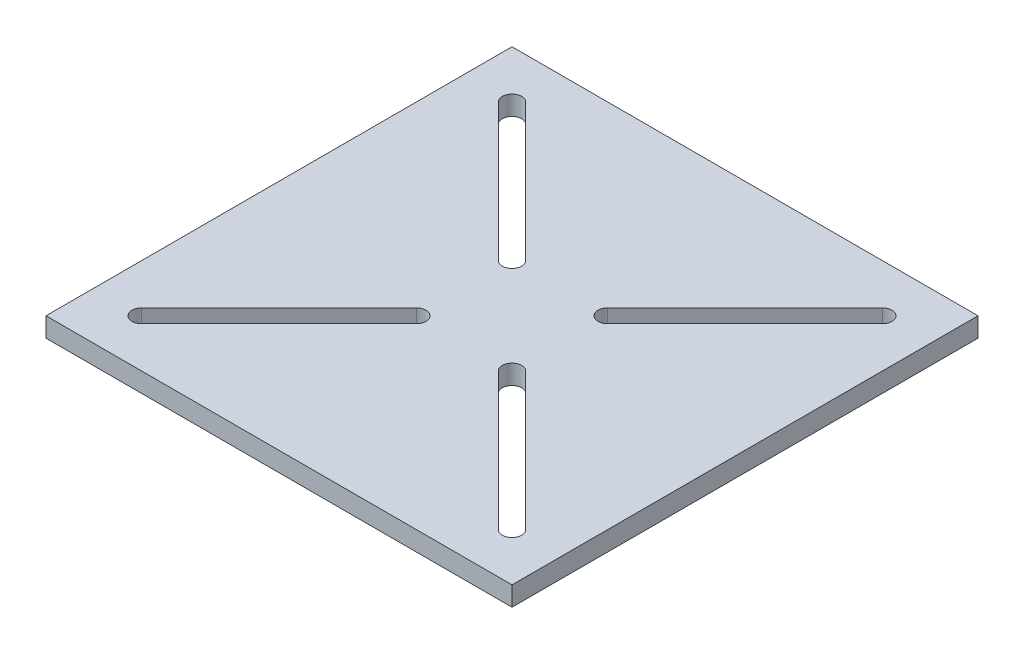
ISO-10303-21;
HEADER;
FILE_DESCRIPTION(('STEP AP214'),'2;1');
FILE_NAME('part.step','',(''),(''),'','','');
FILE_SCHEMA(('AUTOMOTIVE_DESIGN { 1 0 10303 214 1 1 1 1 }'));
ENDSEC;
DATA;
#1=APPLICATION_CONTEXT('core data for automotive mechanical design processes');
#2=APPLICATION_PROTOCOL_DEFINITION('international standard','automotive_design',2000,#1);
#3=PRODUCT_CONTEXT('',#1,'mechanical');
#4=PRODUCT('Part','Part','',(#3));
#5=PRODUCT_RELATED_PRODUCT_CATEGORY('part','',(#4));
#6=PRODUCT_DEFINITION_FORMATION('','',#4);
#7=PRODUCT_DEFINITION_CONTEXT('part definition',#1,'design');
#8=PRODUCT_DEFINITION('design','',#6,#7);
#9=PRODUCT_DEFINITION_SHAPE('','',#8);
#10=(LENGTH_UNIT() NAMED_UNIT(*) SI_UNIT(.MILLI.,.METRE.));
#11=(NAMED_UNIT(*) PLANE_ANGLE_UNIT() SI_UNIT($,.RADIAN.));
#12=(NAMED_UNIT(*) SI_UNIT($,.STERADIAN.) SOLID_ANGLE_UNIT());
#13=UNCERTAINTY_MEASURE_WITH_UNIT(LENGTH_MEASURE(1.E-05),#10,'distance_accuracy_value','');
#14=(GEOMETRIC_REPRESENTATION_CONTEXT(3) GLOBAL_UNCERTAINTY_ASSIGNED_CONTEXT((#13)) GLOBAL_UNIT_ASSIGNED_CONTEXT((#10,
#11,#12)) REPRESENTATION_CONTEXT('',''));
#15=CARTESIAN_POINT('',(0.,0.,0.));
#16=DIRECTION('',(0.,0.,1.));
#17=DIRECTION('',(1.,0.,0.));
#18=AXIS2_PLACEMENT_3D('',#15,#16,#17);
#19=CARTESIAN_POINT('',(0.,6.35,0.));
#20=DIRECTION('',(0.,-1.,0.));
#21=DIRECTION('',(0.,0.,-1.));
#22=AXIS2_PLACEMENT_3D('',#19,#20,#21);
#23=PLANE('',#22);
#24=CARTESIAN_POINT('',(136.750640302673,6.35,-15.6493596973271));
#25=DIRECTION('',(0.,1.,0.));
#26=DIRECTION('',(0.,0.,1.));
#27=AXIS2_PLACEMENT_3D('',#24,#25,#26);
#28=CIRCLE('',#27,3.17499999999973);
#29=CARTESIAN_POINT('',(134.505576272406,6.35,-13.4042956670599));
#30=VERTEX_POINT('',#29);
#31=CARTESIAN_POINT('',(138.99570433294,6.35,-17.8944237275941));
#32=VERTEX_POINT('',#31);
#33=EDGE_CURVE('E206',#30,#32,#28,.T.);
#34=ORIENTED_EDGE('',*,*,#33,.F.);
#35=DIRECTION('',(0.707106781186548,0.,0.707106781186547));
#36=VECTOR('',#35,1.);
#37=CARTESIAN_POINT('',(134.505576272406,6.35,-13.4042956670599));
#38=LINE('',#37,#36);
#39=CARTESIAN_POINT('',(89.6042956670599,6.35,-58.3055762724057));
#40=VERTEX_POINT('',#39);
#41=EDGE_CURVE('E214',#40,#30,#38,.T.);
#42=ORIENTED_EDGE('',*,*,#41,.F.);
#43=CARTESIAN_POINT('',(91.8493596973272,6.35,-60.5506403026729));
#44=DIRECTION('',(0.,1.,0.));
#45=DIRECTION('',(0.,0.,1.));
#46=AXIS2_PLACEMENT_3D('',#43,#44,#45);
#47=CIRCLE('',#46,3.17499999999975);
#48=CARTESIAN_POINT('',(94.0944237275943,6.35,-62.79570433294));
#49=VERTEX_POINT('',#48);
#50=EDGE_CURVE('E211',#49,#40,#47,.T.);
#51=ORIENTED_EDGE('',*,*,#50,.F.);
#52=DIRECTION('',(-0.707106781186547,0.,-0.707106781186548));
#53=VECTOR('',#52,1.);
#54=CARTESIAN_POINT('',(138.99570433294,6.35,-17.8944237275941));
#55=LINE('',#54,#53);
#56=EDGE_CURVE('E208',#32,#49,#55,.T.);
#57=ORIENTED_EDGE('',*,*,#56,.F.);
#58=EDGE_LOOP('',(#34,#42,#51,#57));
#59=FACE_BOUND('',#58,.T.);
#60=CARTESIAN_POINT('',(136.750640302673,6.35,-136.750640302673));
#61=DIRECTION('',(0.,1.,0.));
#62=DIRECTION('',(0.,0.,-1.));
#63=AXIS2_PLACEMENT_3D('',#60,#61,#62);
#64=CIRCLE('',#63,3.17499999999974);
#65=CARTESIAN_POINT('',(138.99570433294,6.35,-134.505576272406));
#66=VERTEX_POINT('',#65);
#67=CARTESIAN_POINT('',(134.505576272406,6.35,-138.99570433294));
#68=VERTEX_POINT('',#67);
#69=EDGE_CURVE('E268',#66,#68,#64,.T.);
#70=ORIENTED_EDGE('',*,*,#69,.F.);
#71=DIRECTION('',(0.707106781186548,0.,-0.707106781186548));
#72=VECTOR('',#71,1.);
#73=CARTESIAN_POINT('',(138.99570433294,6.35,-134.505576272406));
#74=LINE('',#73,#72);
#75=CARTESIAN_POINT('',(94.0944237275943,6.35,-89.6042956670602));
#76=VERTEX_POINT('',#75);
#77=EDGE_CURVE('E276',#76,#66,#74,.T.);
#78=ORIENTED_EDGE('',*,*,#77,.F.);
#79=CARTESIAN_POINT('',(91.8493596973272,6.35,-91.8493596973271));
#80=DIRECTION('',(0.,1.,0.));
#81=DIRECTION('',(0.,0.,-1.));
#82=AXIS2_PLACEMENT_3D('',#79,#80,#81);
#83=CIRCLE('',#82,3.17499999999975);
#84=CARTESIAN_POINT('',(89.6042956670599,6.35,-94.0944237275943));
#85=VERTEX_POINT('',#84);
#86=EDGE_CURVE('E273',#85,#76,#83,.T.);
#87=ORIENTED_EDGE('',*,*,#86,.F.);
#88=DIRECTION('',(-0.707106781186548,0.,0.707106781186547));
#89=VECTOR('',#88,1.);
#90=CARTESIAN_POINT('',(134.505576272406,6.35,-138.99570433294));
#91=LINE('',#90,#89);
#92=EDGE_CURVE('E270',#68,#85,#91,.T.);
#93=ORIENTED_EDGE('',*,*,#92,.F.);
#94=EDGE_LOOP('',(#70,#78,#87,#93));
#95=FACE_BOUND('',#94,.T.);
#96=DIRECTION('',(0.,0.,1.));
#97=VECTOR('',#96,1.);
#98=CARTESIAN_POINT('',(0.,6.35,0.));
#99=LINE('',#98,#97);
#100=CARTESIAN_POINT('',(0.,6.35,-152.4));
#101=VERTEX_POINT('',#100);
#102=CARTESIAN_POINT('',(0.,6.35,0.));
#103=VERTEX_POINT('',#102);
#104=EDGE_CURVE('E299',#101,#103,#99,.T.);
#105=ORIENTED_EDGE('',*,*,#104,.T.);
#106=DIRECTION('',(1.,0.,0.));
#107=VECTOR('',#106,1.);
#108=CARTESIAN_POINT('',(0.,6.35,0.));
#109=LINE('',#108,#107);
#110=CARTESIAN_POINT('',(152.4,6.35,0.));
#111=VERTEX_POINT('',#110);
#112=EDGE_CURVE('E302',#103,#111,#109,.T.);
#113=ORIENTED_EDGE('',*,*,#112,.T.);
#114=DIRECTION('',(0.,0.,-1.));
#115=VECTOR('',#114,1.);
#116=CARTESIAN_POINT('',(152.4,6.35,0.));
#117=LINE('',#116,#115);
#118=CARTESIAN_POINT('',(152.4,6.35,-152.4));
#119=VERTEX_POINT('',#118);
#120=EDGE_CURVE('E305',#111,#119,#117,.T.);
#121=ORIENTED_EDGE('',*,*,#120,.T.);
#122=DIRECTION('',(-1.,0.,0.));
#123=VECTOR('',#122,1.);
#124=CARTESIAN_POINT('',(0.,6.35,-152.4));
#125=LINE('',#124,#123);
#126=EDGE_CURVE('E307',#119,#101,#125,.T.);
#127=ORIENTED_EDGE('',*,*,#126,.T.);
#128=EDGE_LOOP('',(#105,#113,#121,#127));
#129=FACE_BOUND('',#128,.T.);
#130=CARTESIAN_POINT('',(15.649359697327,6.35,-136.750640302673));
#131=DIRECTION('',(0.,1.,0.));
#132=DIRECTION('',(0.,0.,1.));
#133=AXIS2_PLACEMENT_3D('',#130,#131,#132);
#134=CIRCLE('',#133,3.17499999999975);
#135=CARTESIAN_POINT('',(17.8944237275942,6.35,-138.99570433294));
#136=VERTEX_POINT('',#135);
#137=CARTESIAN_POINT('',(13.40429566706,6.35,-134.505576272406));
#138=VERTEX_POINT('',#137);
#139=EDGE_CURVE('E237',#136,#138,#134,.T.);
#140=ORIENTED_EDGE('',*,*,#139,.F.);
#141=DIRECTION('',(-0.707106781186548,0.,-0.707106781186547));
#142=VECTOR('',#141,1.);
#143=CARTESIAN_POINT('',(17.8944237275942,6.35,-138.99570433294));
#144=LINE('',#143,#142);
#145=CARTESIAN_POINT('',(62.79570433294,6.35,-94.0944237275943));
#146=VERTEX_POINT('',#145);
#147=EDGE_CURVE('E245',#146,#136,#144,.T.);
#148=ORIENTED_EDGE('',*,*,#147,.F.);
#149=CARTESIAN_POINT('',(60.5506403026728,6.35,-91.8493596973271));
#150=DIRECTION('',(0.,1.,0.));
#151=DIRECTION('',(0.,0.,1.));
#152=AXIS2_PLACEMENT_3D('',#149,#150,#151);
#153=CIRCLE('',#152,3.17499999999975);
#154=CARTESIAN_POINT('',(58.3055762724057,6.35,-89.6042956670599));
#155=VERTEX_POINT('',#154);
#156=EDGE_CURVE('E242',#155,#146,#153,.T.);
#157=ORIENTED_EDGE('',*,*,#156,.F.);
#158=DIRECTION('',(0.707106781186548,0.,0.707106781186547));
#159=VECTOR('',#158,1.);
#160=CARTESIAN_POINT('',(13.40429566706,6.35,-134.505576272406));
#161=LINE('',#160,#159);
#162=EDGE_CURVE('E239',#138,#155,#161,.T.);
#163=ORIENTED_EDGE('',*,*,#162,.F.);
#164=EDGE_LOOP('',(#140,#148,#157,#163));
#165=FACE_BOUND('',#164,.T.);
#166=CARTESIAN_POINT('',(15.649359697327,6.35,-15.6493596973271));
#167=DIRECTION('',(0.,1.,0.));
#168=DIRECTION('',(0.,0.,-1.));
#169=AXIS2_PLACEMENT_3D('',#166,#167,#168);
#170=CIRCLE('',#169,3.17499999999973);
#171=CARTESIAN_POINT('',(13.40429566706,6.35,-17.8944237275941));
#172=VERTEX_POINT('',#171);
#173=CARTESIAN_POINT('',(17.8944237275942,6.35,-13.4042956670599));
#174=VERTEX_POINT('',#173);
#175=EDGE_CURVE('E170',#172,#174,#170,.T.);
#176=ORIENTED_EDGE('',*,*,#175,.F.);
#177=DIRECTION('',(-0.707106781186547,0.,0.707106781186548));
#178=VECTOR('',#177,1.);
#179=CARTESIAN_POINT('',(13.40429566706,6.35,-17.8944237275941));
#180=LINE('',#179,#178);
#181=CARTESIAN_POINT('',(58.3055762724057,6.35,-62.7957043329398));
#182=VERTEX_POINT('',#181);
#183=EDGE_CURVE('E192',#182,#172,#180,.T.);
#184=ORIENTED_EDGE('',*,*,#183,.F.);
#185=CARTESIAN_POINT('',(60.5506403026728,6.35,-60.5506403026729));
#186=DIRECTION('',(0.,1.,0.));
#187=DIRECTION('',(0.,0.,-1.));
#188=AXIS2_PLACEMENT_3D('',#185,#186,#187);
#189=CIRCLE('',#188,3.17499999999975);
#190=CARTESIAN_POINT('',(62.79570433294,6.35,-58.3055762724057));
#191=VERTEX_POINT('',#190);
#192=EDGE_CURVE('E190',#191,#182,#189,.T.);
#193=ORIENTED_EDGE('',*,*,#192,.F.);
#194=DIRECTION('',(0.707106781186548,0.,-0.707106781186547));
#195=VECTOR('',#194,1.);
#196=CARTESIAN_POINT('',(17.8944237275942,6.35,-13.4042956670599));
#197=LINE('',#196,#195);
#198=EDGE_CURVE('E178',#174,#191,#197,.T.);
#199=ORIENTED_EDGE('',*,*,#198,.F.);
#200=EDGE_LOOP('',(#176,#184,#193,#199));
#201=FACE_BOUND('',#200,.T.);
#202=ADVANCED_FACE('F33',(#59,#95,#129,#165,#201),#23,.F.);
#203=CARTESIAN_POINT('',(0.,0.,0.));
#204=DIRECTION('',(0.,-1.,0.));
#205=DIRECTION('',(0.,0.,-1.));
#206=AXIS2_PLACEMENT_3D('',#203,#204,#205);
#207=PLANE('',#206);
#208=DIRECTION('',(0.,0.,1.));
#209=VECTOR('',#208,1.);
#210=CARTESIAN_POINT('',(0.,0.,0.));
#211=LINE('',#210,#209);
#212=CARTESIAN_POINT('',(0.,0.,-152.4));
#213=VERTEX_POINT('',#212);
#214=CARTESIAN_POINT('',(0.,0.,0.));
#215=VERTEX_POINT('',#214);
#216=EDGE_CURVE('E298',#213,#215,#211,.T.);
#217=ORIENTED_EDGE('',*,*,#216,.F.);
#218=DIRECTION('',(-1.,0.,0.));
#219=VECTOR('',#218,1.);
#220=CARTESIAN_POINT('',(0.,0.,-152.4));
#221=LINE('',#220,#219);
#222=CARTESIAN_POINT('',(152.4,0.,-152.4));
#223=VERTEX_POINT('',#222);
#224=EDGE_CURVE('E303',#223,#213,#221,.T.);
#225=ORIENTED_EDGE('',*,*,#224,.F.);
#226=DIRECTION('',(0.,0.,-1.));
#227=VECTOR('',#226,1.);
#228=CARTESIAN_POINT('',(152.4,0.,0.));
#229=LINE('',#228,#227);
#230=CARTESIAN_POINT('',(152.4,0.,0.));
#231=VERTEX_POINT('',#230);
#232=EDGE_CURVE('E314',#231,#223,#229,.T.);
#233=ORIENTED_EDGE('',*,*,#232,.F.);
#234=DIRECTION('',(1.,0.,0.));
#235=VECTOR('',#234,1.);
#236=CARTESIAN_POINT('',(0.,0.,0.));
#237=LINE('',#236,#235);
#238=EDGE_CURVE('E312',#215,#231,#237,.T.);
#239=ORIENTED_EDGE('',*,*,#238,.F.);
#240=EDGE_LOOP('',(#217,#225,#233,#239));
#241=FACE_BOUND('',#240,.T.);
#242=DIRECTION('',(0.707106781186548,0.,-0.707106781186548));
#243=VECTOR('',#242,1.);
#244=CARTESIAN_POINT('',(138.99570433294,0.,-134.505576272406));
#245=LINE('',#244,#243);
#246=CARTESIAN_POINT('',(94.0944237275943,0.,-89.6042956670599));
#247=VERTEX_POINT('',#246);
#248=CARTESIAN_POINT('',(138.99570433294,0.,-134.505576272406));
#249=VERTEX_POINT('',#248);
#250=EDGE_CURVE('E271',#247,#249,#245,.T.);
#251=ORIENTED_EDGE('',*,*,#250,.T.);
#252=CARTESIAN_POINT('',(136.750640302673,0.,-136.750640302673));
#253=DIRECTION('',(0.,1.,0.));
#254=DIRECTION('',(0.,0.,-1.));
#255=AXIS2_PLACEMENT_3D('',#252,#253,#254);
#256=CIRCLE('',#255,3.17499999999974);
#257=CARTESIAN_POINT('',(134.505576272406,0.,-138.99570433294));
#258=VERTEX_POINT('',#257);
#259=EDGE_CURVE('E267',#249,#258,#256,.T.);
#260=ORIENTED_EDGE('',*,*,#259,.T.);
#261=DIRECTION('',(-0.707106781186548,0.,0.707106781186547));
#262=VECTOR('',#261,1.);
#263=CARTESIAN_POINT('',(134.505576272406,0.,-138.99570433294));
#264=LINE('',#263,#262);
#265=CARTESIAN_POINT('',(89.6042956670599,0.,-94.0944237275943));
#266=VERTEX_POINT('',#265);
#267=EDGE_CURVE('E281',#258,#266,#264,.T.);
#268=ORIENTED_EDGE('',*,*,#267,.T.);
#269=CARTESIAN_POINT('',(91.8493596973272,0.,-91.8493596973271));
#270=DIRECTION('',(0.,1.,0.));
#271=DIRECTION('',(0.,0.,-1.));
#272=AXIS2_PLACEMENT_3D('',#269,#270,#271);
#273=CIRCLE('',#272,3.17499999999975);
#274=EDGE_CURVE('E284',#266,#247,#273,.T.);
#275=ORIENTED_EDGE('',*,*,#274,.T.);
#276=EDGE_LOOP('',(#251,#260,#268,#275));
#277=FACE_BOUND('',#276,.T.);
#278=DIRECTION('',(-0.707106781186548,0.,-0.707106781186547));
#279=VECTOR('',#278,1.);
#280=CARTESIAN_POINT('',(17.8944237275942,0.,-138.99570433294));
#281=LINE('',#280,#279);
#282=CARTESIAN_POINT('',(62.79570433294,0.,-94.0944237275943));
#283=VERTEX_POINT('',#282);
#284=CARTESIAN_POINT('',(17.8944237275942,0.,-138.99570433294));
#285=VERTEX_POINT('',#284);
#286=EDGE_CURVE('E240',#283,#285,#281,.T.);
#287=ORIENTED_EDGE('',*,*,#286,.T.);
#288=CARTESIAN_POINT('',(15.649359697327,0.,-136.750640302673));
#289=DIRECTION('',(0.,1.,0.));
#290=DIRECTION('',(0.,0.,1.));
#291=AXIS2_PLACEMENT_3D('',#288,#289,#290);
#292=CIRCLE('',#291,3.17499999999975);
#293=CARTESIAN_POINT('',(13.40429566706,0.,-134.505576272406));
#294=VERTEX_POINT('',#293);
#295=EDGE_CURVE('E236',#285,#294,#292,.T.);
#296=ORIENTED_EDGE('',*,*,#295,.T.);
#297=DIRECTION('',(0.707106781186548,0.,0.707106781186547));
#298=VECTOR('',#297,1.);
#299=CARTESIAN_POINT('',(13.40429566706,0.,-134.505576272406));
#300=LINE('',#299,#298);
#301=CARTESIAN_POINT('',(58.3055762724057,0.,-89.6042956670599));
#302=VERTEX_POINT('',#301);
#303=EDGE_CURVE('E250',#294,#302,#300,.T.);
#304=ORIENTED_EDGE('',*,*,#303,.T.);
#305=CARTESIAN_POINT('',(60.5506403026728,0.,-91.8493596973271));
#306=DIRECTION('',(0.,1.,0.));
#307=DIRECTION('',(0.,0.,1.));
#308=AXIS2_PLACEMENT_3D('',#305,#306,#307);
#309=CIRCLE('',#308,3.17499999999975);
#310=EDGE_CURVE('E253',#302,#283,#309,.T.);
#311=ORIENTED_EDGE('',*,*,#310,.T.);
#312=EDGE_LOOP('',(#287,#296,#304,#311));
#313=FACE_BOUND('',#312,.T.);
#314=DIRECTION('',(0.707106781186548,0.,0.707106781186547));
#315=VECTOR('',#314,1.);
#316=CARTESIAN_POINT('',(134.505576272406,0.,-13.4042956670599));
#317=LINE('',#316,#315);
#318=CARTESIAN_POINT('',(89.6042956670599,0.,-58.3055762724057));
#319=VERTEX_POINT('',#318);
#320=CARTESIAN_POINT('',(134.505576272406,0.,-13.4042956670599));
#321=VERTEX_POINT('',#320);
#322=EDGE_CURVE('E209',#319,#321,#317,.T.);
#323=ORIENTED_EDGE('',*,*,#322,.T.);
#324=CARTESIAN_POINT('',(136.750640302673,0.,-15.6493596973271));
#325=DIRECTION('',(0.,1.,0.));
#326=DIRECTION('',(0.,0.,1.));
#327=AXIS2_PLACEMENT_3D('',#324,#325,#326);
#328=CIRCLE('',#327,3.17499999999973);
#329=CARTESIAN_POINT('',(138.99570433294,0.,-17.8944237275941));
#330=VERTEX_POINT('',#329);
#331=EDGE_CURVE('E186',#321,#330,#328,.T.);
#332=ORIENTED_EDGE('',*,*,#331,.T.);
#333=DIRECTION('',(-0.707106781186547,0.,-0.707106781186548));
#334=VECTOR('',#333,1.);
#335=CARTESIAN_POINT('',(138.99570433294,0.,-17.8944237275941));
#336=LINE('',#335,#334);
#337=CARTESIAN_POINT('',(94.0944237275943,0.,-62.79570433294));
#338=VERTEX_POINT('',#337);
#339=EDGE_CURVE('E219',#330,#338,#336,.T.);
#340=ORIENTED_EDGE('',*,*,#339,.T.);
#341=CARTESIAN_POINT('',(91.8493596973272,0.,-60.5506403026729));
#342=DIRECTION('',(0.,1.,0.));
#343=DIRECTION('',(0.,0.,1.));
#344=AXIS2_PLACEMENT_3D('',#341,#342,#343);
#345=CIRCLE('',#344,3.17499999999975);
#346=EDGE_CURVE('E222',#338,#319,#345,.T.);
#347=ORIENTED_EDGE('',*,*,#346,.T.);
#348=EDGE_LOOP('',(#323,#332,#340,#347));
#349=FACE_BOUND('',#348,.T.);
#350=DIRECTION('',(-0.707106781186547,0.,0.707106781186548));
#351=VECTOR('',#350,1.);
#352=CARTESIAN_POINT('',(13.40429566706,0.,-17.8944237275941));
#353=LINE('',#352,#351);
#354=CARTESIAN_POINT('',(58.3055762724057,0.,-62.79570433294));
#355=VERTEX_POINT('',#354);
#356=CARTESIAN_POINT('',(13.40429566706,0.,-17.8944237275941));
#357=VERTEX_POINT('',#356);
#358=EDGE_CURVE('E179',#355,#357,#353,.T.);
#359=ORIENTED_EDGE('',*,*,#358,.T.);
#360=CARTESIAN_POINT('',(15.649359697327,0.,-15.6493596973271));
#361=DIRECTION('',(0.,1.,0.));
#362=DIRECTION('',(0.,0.,-1.));
#363=AXIS2_PLACEMENT_3D('',#360,#361,#362);
#364=CIRCLE('',#363,3.17499999999973);
#365=CARTESIAN_POINT('',(17.8944237275942,0.,-13.4042956670599));
#366=VERTEX_POINT('',#365);
#367=EDGE_CURVE('E56',#357,#366,#364,.T.);
#368=ORIENTED_EDGE('',*,*,#367,.T.);
#369=DIRECTION('',(0.707106781186548,0.,-0.707106781186547));
#370=VECTOR('',#369,1.);
#371=CARTESIAN_POINT('',(17.8944237275942,0.,-13.4042956670599));
#372=LINE('',#371,#370);
#373=CARTESIAN_POINT('',(62.79570433294,0.,-58.3055762724057));
#374=VERTEX_POINT('',#373);
#375=EDGE_CURVE('E185',#366,#374,#372,.T.);
#376=ORIENTED_EDGE('',*,*,#375,.T.);
#377=CARTESIAN_POINT('',(60.5506403026728,0.,-60.5506403026729));
#378=DIRECTION('',(0.,1.,0.));
#379=DIRECTION('',(0.,0.,-1.));
#380=AXIS2_PLACEMENT_3D('',#377,#378,#379);
#381=CIRCLE('',#380,3.17499999999975);
#382=EDGE_CURVE('E198',#374,#355,#381,.T.);
#383=ORIENTED_EDGE('',*,*,#382,.T.);
#384=EDGE_LOOP('',(#359,#368,#376,#383));
#385=FACE_BOUND('',#384,.T.);
#386=ADVANCED_FACE('F332',(#241,#277,#313,#349,#385),#207,.T.);
#387=CARTESIAN_POINT('',(0.,6.35,0.));
#388=DIRECTION('',(1.,0.,0.));
#389=DIRECTION('',(0.,0.,-1.));
#390=AXIS2_PLACEMENT_3D('',#387,#388,#389);
#391=PLANE('',#390);
#392=ORIENTED_EDGE('',*,*,#216,.T.);
#393=DIRECTION('',(0.,-1.,0.));
#394=VECTOR('',#393,1.);
#395=CARTESIAN_POINT('',(0.,6.35,0.));
#396=LINE('',#395,#394);
#397=EDGE_CURVE('E11',#103,#215,#396,.T.);
#398=ORIENTED_EDGE('',*,*,#397,.F.);
#399=ORIENTED_EDGE('',*,*,#104,.F.);
#400=DIRECTION('',(0.,-1.,0.));
#401=VECTOR('',#400,1.);
#402=CARTESIAN_POINT('',(0.,6.35,-152.4));
#403=LINE('',#402,#401);
#404=EDGE_CURVE('E309',#101,#213,#403,.T.);
#405=ORIENTED_EDGE('',*,*,#404,.T.);
#406=EDGE_LOOP('',(#392,#398,#399,#405));
#407=FACE_BOUND('',#406,.T.);
#408=ADVANCED_FACE('F35',(#407),#391,.F.);
#409=CARTESIAN_POINT('',(0.,6.35,0.));
#410=DIRECTION('',(0.,0.,-1.));
#411=DIRECTION('',(-1.,0.,0.));
#412=AXIS2_PLACEMENT_3D('',#409,#410,#411);
#413=PLANE('',#412);
#414=ORIENTED_EDGE('',*,*,#238,.T.);
#415=DIRECTION('',(0.,-1.,0.));
#416=VECTOR('',#415,1.);
#417=CARTESIAN_POINT('',(152.4,6.35,0.));
#418=LINE('',#417,#416);
#419=EDGE_CURVE('E41',#111,#231,#418,.T.);
#420=ORIENTED_EDGE('',*,*,#419,.F.);
#421=ORIENTED_EDGE('',*,*,#112,.F.);
#422=ORIENTED_EDGE('',*,*,#397,.T.);
#423=EDGE_LOOP('',(#414,#420,#421,#422));
#424=FACE_BOUND('',#423,.T.);
#425=ADVANCED_FACE('F343',(#424),#413,.F.);
#426=CARTESIAN_POINT('',(152.4,6.35,0.));
#427=DIRECTION('',(-1.,0.,0.));
#428=DIRECTION('',(0.,0.,1.));
#429=AXIS2_PLACEMENT_3D('',#426,#427,#428);
#430=PLANE('',#429);
#431=ORIENTED_EDGE('',*,*,#232,.T.);
#432=DIRECTION('',(0.,-1.,0.));
#433=VECTOR('',#432,1.);
#434=CARTESIAN_POINT('',(152.4,6.35,-152.4));
#435=LINE('',#434,#433);
#436=EDGE_CURVE('E319',#119,#223,#435,.T.);
#437=ORIENTED_EDGE('',*,*,#436,.F.);
#438=ORIENTED_EDGE('',*,*,#120,.F.);
#439=ORIENTED_EDGE('',*,*,#419,.T.);
#440=EDGE_LOOP('',(#431,#437,#438,#439));
#441=FACE_BOUND('',#440,.T.);
#442=ADVANCED_FACE('F326',(#441),#430,.F.);
#443=CARTESIAN_POINT('',(0.,6.35,-152.4));
#444=DIRECTION('',(0.,0.,1.));
#445=DIRECTION('',(1.,0.,0.));
#446=AXIS2_PLACEMENT_3D('',#443,#444,#445);
#447=PLANE('',#446);
#448=ORIENTED_EDGE('',*,*,#224,.T.);
#449=ORIENTED_EDGE('',*,*,#404,.F.);
#450=ORIENTED_EDGE('',*,*,#126,.F.);
#451=ORIENTED_EDGE('',*,*,#436,.T.);
#452=EDGE_LOOP('',(#448,#449,#450,#451));
#453=FACE_BOUND('',#452,.T.);
#454=ADVANCED_FACE('F336',(#453),#447,.F.);
#455=CARTESIAN_POINT('',(136.750640302673,6.35,-136.750640302673));
#456=DIRECTION('',(0.,-1.,0.));
#457=DIRECTION('',(0.,0.,-1.));
#458=AXIS2_PLACEMENT_3D('',#455,#456,#457);
#459=CYLINDRICAL_SURFACE('',#458,3.17499999999974);
#460=ORIENTED_EDGE('',*,*,#259,.F.);
#461=DIRECTION('',(0.,-1.,0.));
#462=VECTOR('',#461,1.);
#463=CARTESIAN_POINT('',(138.99570433294,6.35,-134.505576272406));
#464=LINE('',#463,#462);
#465=EDGE_CURVE('E278',#66,#249,#464,.T.);
#466=ORIENTED_EDGE('',*,*,#465,.F.);
#467=ORIENTED_EDGE('',*,*,#69,.T.);
#468=DIRECTION('',(0.,-1.,0.));
#469=VECTOR('',#468,1.);
#470=CARTESIAN_POINT('',(134.505576272406,6.35,-138.99570433294));
#471=LINE('',#470,#469);
#472=EDGE_CURVE('E295',#68,#258,#471,.T.);
#473=ORIENTED_EDGE('',*,*,#472,.T.);
#474=EDGE_LOOP('',(#460,#466,#467,#473));
#475=FACE_BOUND('',#474,.T.);
#476=ADVANCED_FACE('F360',(#475),#459,.F.);
#477=CARTESIAN_POINT('',(134.505576272406,6.35,-138.99570433294));
#478=DIRECTION('',(0.707106781186547,0.,0.707106781186548));
#479=DIRECTION('',(0.707106781186548,0.,-0.707106781186547));
#480=AXIS2_PLACEMENT_3D('',#477,#478,#479);
#481=PLANE('',#480);
#482=ORIENTED_EDGE('',*,*,#267,.F.);
#483=ORIENTED_EDGE('',*,*,#472,.F.);
#484=ORIENTED_EDGE('',*,*,#92,.T.);
#485=DIRECTION('',(0.,-1.,0.));
#486=VECTOR('',#485,1.);
#487=CARTESIAN_POINT('',(89.6042956670599,6.35,-94.0944237275943));
#488=LINE('',#487,#486);
#489=EDGE_CURVE('E293',#85,#266,#488,.T.);
#490=ORIENTED_EDGE('',*,*,#489,.T.);
#491=EDGE_LOOP('',(#482,#483,#484,#490));
#492=FACE_BOUND('',#491,.T.);
#493=ADVANCED_FACE('F367',(#492),#481,.T.);
#494=CARTESIAN_POINT('',(91.8493596973272,6.35,-91.8493596973271));
#495=DIRECTION('',(0.,-1.,0.));
#496=DIRECTION('',(0.,0.,-1.));
#497=AXIS2_PLACEMENT_3D('',#494,#495,#496);
#498=CYLINDRICAL_SURFACE('',#497,3.17499999999975);
#499=ORIENTED_EDGE('',*,*,#274,.F.);
#500=ORIENTED_EDGE('',*,*,#489,.F.);
#501=ORIENTED_EDGE('',*,*,#86,.T.);
#502=DIRECTION('',(0.,-1.,0.));
#503=VECTOR('',#502,1.);
#504=CARTESIAN_POINT('',(94.0944237275943,6.35,-89.6042956670599));
#505=LINE('',#504,#503);
#506=EDGE_CURVE('E291',#76,#247,#505,.T.);
#507=ORIENTED_EDGE('',*,*,#506,.T.);
#508=EDGE_LOOP('',(#499,#500,#501,#507));
#509=FACE_BOUND('',#508,.T.);
#510=ADVANCED_FACE('F372',(#509),#498,.F.);
#511=CARTESIAN_POINT('',(138.99570433294,6.35,-134.505576272406));
#512=DIRECTION('',(-0.707106781186548,0.,-0.707106781186548));
#513=DIRECTION('',(-0.707106781186548,0.,0.707106781186548));
#514=AXIS2_PLACEMENT_3D('',#511,#512,#513);
#515=PLANE('',#514);
#516=ORIENTED_EDGE('',*,*,#250,.F.);
#517=ORIENTED_EDGE('',*,*,#506,.F.);
#518=ORIENTED_EDGE('',*,*,#77,.T.);
#519=ORIENTED_EDGE('',*,*,#465,.T.);
#520=EDGE_LOOP('',(#516,#517,#518,#519));
#521=FACE_BOUND('',#520,.T.);
#522=ADVANCED_FACE('F379',(#521),#515,.T.);
#523=CARTESIAN_POINT('',(15.649359697327,6.35,-136.750640302673));
#524=DIRECTION('',(0.,-1.,0.));
#525=DIRECTION('',(0.,0.,-1.));
#526=AXIS2_PLACEMENT_3D('',#523,#524,#525);
#527=CYLINDRICAL_SURFACE('',#526,3.17499999999975);
#528=ORIENTED_EDGE('',*,*,#295,.F.);
#529=DIRECTION('',(0.,-1.,0.));
#530=VECTOR('',#529,1.);
#531=CARTESIAN_POINT('',(17.8944237275942,6.35,-138.99570433294));
#532=LINE('',#531,#530);
#533=EDGE_CURVE('E247',#136,#285,#532,.T.);
#534=ORIENTED_EDGE('',*,*,#533,.F.);
#535=ORIENTED_EDGE('',*,*,#139,.T.);
#536=DIRECTION('',(0.,-1.,0.));
#537=VECTOR('',#536,1.);
#538=CARTESIAN_POINT('',(13.40429566706,6.35,-134.505576272406));
#539=LINE('',#538,#537);
#540=EDGE_CURVE('E264',#138,#294,#539,.T.);
#541=ORIENTED_EDGE('',*,*,#540,.T.);
#542=EDGE_LOOP('',(#528,#534,#535,#541));
#543=FACE_BOUND('',#542,.T.);
#544=ADVANCED_FACE('F392',(#543),#527,.F.);
#545=CARTESIAN_POINT('',(13.40429566706,6.35,-134.505576272406));
#546=DIRECTION('',(0.707106781186547,0.,-0.707106781186548));
#547=DIRECTION('',(-0.707106781186548,0.,-0.707106781186547));
#548=AXIS2_PLACEMENT_3D('',#545,#546,#547);
#549=PLANE('',#548);
#550=ORIENTED_EDGE('',*,*,#303,.F.);
#551=ORIENTED_EDGE('',*,*,#540,.F.);
#552=ORIENTED_EDGE('',*,*,#162,.T.);
#553=DIRECTION('',(0.,-1.,0.));
#554=VECTOR('',#553,1.);
#555=CARTESIAN_POINT('',(58.3055762724057,6.35,-89.6042956670599));
#556=LINE('',#555,#554);
#557=EDGE_CURVE('E262',#155,#302,#556,.T.);
#558=ORIENTED_EDGE('',*,*,#557,.T.);
#559=EDGE_LOOP('',(#550,#551,#552,#558));
#560=FACE_BOUND('',#559,.T.);
#561=ADVANCED_FACE('F397',(#560),#549,.T.);
#562=CARTESIAN_POINT('',(60.5506403026728,6.35,-91.8493596973271));
#563=DIRECTION('',(0.,-1.,0.));
#564=DIRECTION('',(0.,0.,-1.));
#565=AXIS2_PLACEMENT_3D('',#562,#563,#564);
#566=CYLINDRICAL_SURFACE('',#565,3.17499999999975);
#567=ORIENTED_EDGE('',*,*,#310,.F.);
#568=ORIENTED_EDGE('',*,*,#557,.F.);
#569=ORIENTED_EDGE('',*,*,#156,.T.);
#570=DIRECTION('',(0.,-1.,0.));
#571=VECTOR('',#570,1.);
#572=CARTESIAN_POINT('',(62.79570433294,6.35,-94.0944237275943));
#573=LINE('',#572,#571);
#574=EDGE_CURVE('E260',#146,#283,#573,.T.);
#575=ORIENTED_EDGE('',*,*,#574,.T.);
#576=EDGE_LOOP('',(#567,#568,#569,#575));
#577=FACE_BOUND('',#576,.T.);
#578=ADVANCED_FACE('F401',(#577),#566,.F.);
#579=CARTESIAN_POINT('',(17.8944237275942,6.35,-138.99570433294));
#580=DIRECTION('',(-0.707106781186547,0.,0.707106781186548));
#581=DIRECTION('',(0.707106781186548,0.,0.707106781186547));
#582=AXIS2_PLACEMENT_3D('',#579,#580,#581);
#583=PLANE('',#582);
#584=ORIENTED_EDGE('',*,*,#286,.F.);
#585=ORIENTED_EDGE('',*,*,#574,.F.);
#586=ORIENTED_EDGE('',*,*,#147,.T.);
#587=ORIENTED_EDGE('',*,*,#533,.T.);
#588=EDGE_LOOP('',(#584,#585,#586,#587));
#589=FACE_BOUND('',#588,.T.);
#590=ADVANCED_FACE('F405',(#589),#583,.T.);
#591=CARTESIAN_POINT('',(136.750640302673,6.35,-15.6493596973271));
#592=DIRECTION('',(0.,-1.,0.));
#593=DIRECTION('',(0.,0.,-1.));
#594=AXIS2_PLACEMENT_3D('',#591,#592,#593);
#595=CYLINDRICAL_SURFACE('',#594,3.17499999999973);
#596=ORIENTED_EDGE('',*,*,#331,.F.);
#597=DIRECTION('',(0.,-1.,0.));
#598=VECTOR('',#597,1.);
#599=CARTESIAN_POINT('',(134.505576272406,6.35,-13.4042956670599));
#600=LINE('',#599,#598);
#601=EDGE_CURVE('E216',#30,#321,#600,.T.);
#602=ORIENTED_EDGE('',*,*,#601,.F.);
#603=ORIENTED_EDGE('',*,*,#33,.T.);
#604=DIRECTION('',(0.,-1.,0.));
#605=VECTOR('',#604,1.);
#606=CARTESIAN_POINT('',(138.99570433294,6.35,-17.8944237275941));
#607=LINE('',#606,#605);
#608=EDGE_CURVE('E233',#32,#330,#607,.T.);
#609=ORIENTED_EDGE('',*,*,#608,.T.);
#610=EDGE_LOOP('',(#596,#602,#603,#609));
#611=FACE_BOUND('',#610,.T.);
#612=ADVANCED_FACE('F409',(#611),#595,.F.);
#613=CARTESIAN_POINT('',(138.99570433294,6.35,-17.8944237275941));
#614=DIRECTION('',(-0.707106781186548,0.,0.707106781186547));
#615=DIRECTION('',(0.707106781186547,0.,0.707106781186548));
#616=AXIS2_PLACEMENT_3D('',#613,#614,#615);
#617=PLANE('',#616);
#618=ORIENTED_EDGE('',*,*,#339,.F.);
#619=ORIENTED_EDGE('',*,*,#608,.F.);
#620=ORIENTED_EDGE('',*,*,#56,.T.);
#621=DIRECTION('',(0.,-1.,0.));
#622=VECTOR('',#621,1.);
#623=CARTESIAN_POINT('',(94.0944237275943,6.35,-62.79570433294));
#624=LINE('',#623,#622);
#625=EDGE_CURVE('E231',#49,#338,#624,.T.);
#626=ORIENTED_EDGE('',*,*,#625,.T.);
#627=EDGE_LOOP('',(#618,#619,#620,#626));
#628=FACE_BOUND('',#627,.T.);
#629=ADVANCED_FACE('F413',(#628),#617,.T.);
#630=CARTESIAN_POINT('',(91.8493596973272,6.35,-60.5506403026729));
#631=DIRECTION('',(0.,-1.,0.));
#632=DIRECTION('',(0.,0.,-1.));
#633=AXIS2_PLACEMENT_3D('',#630,#631,#632);
#634=CYLINDRICAL_SURFACE('',#633,3.17499999999975);
#635=ORIENTED_EDGE('',*,*,#346,.F.);
#636=ORIENTED_EDGE('',*,*,#625,.F.);
#637=ORIENTED_EDGE('',*,*,#50,.T.);
#638=DIRECTION('',(0.,-1.,0.));
#639=VECTOR('',#638,1.);
#640=CARTESIAN_POINT('',(89.6042956670599,6.35,-58.3055762724057));
#641=LINE('',#640,#639);
#642=EDGE_CURVE('E229',#40,#319,#641,.T.);
#643=ORIENTED_EDGE('',*,*,#642,.T.);
#644=EDGE_LOOP('',(#635,#636,#637,#643));
#645=FACE_BOUND('',#644,.T.);
#646=ADVANCED_FACE('F417',(#645),#634,.F.);
#647=CARTESIAN_POINT('',(134.505576272406,6.35,-13.4042956670599));
#648=DIRECTION('',(0.707106781186547,0.,-0.707106781186548));
#649=DIRECTION('',(-0.707106781186548,0.,-0.707106781186547));
#650=AXIS2_PLACEMENT_3D('',#647,#648,#649);
#651=PLANE('',#650);
#652=ORIENTED_EDGE('',*,*,#322,.F.);
#653=ORIENTED_EDGE('',*,*,#642,.F.);
#654=ORIENTED_EDGE('',*,*,#41,.T.);
#655=ORIENTED_EDGE('',*,*,#601,.T.);
#656=EDGE_LOOP('',(#652,#653,#654,#655));
#657=FACE_BOUND('',#656,.T.);
#658=ADVANCED_FACE('F421',(#657),#651,.T.);
#659=CARTESIAN_POINT('',(15.649359697327,6.35,-15.6493596973271));
#660=DIRECTION('',(0.,-1.,0.));
#661=DIRECTION('',(0.,0.,-1.));
#662=AXIS2_PLACEMENT_3D('',#659,#660,#661);
#663=CYLINDRICAL_SURFACE('',#662,3.17499999999973);
#664=ORIENTED_EDGE('',*,*,#367,.F.);
#665=DIRECTION('',(0.,-1.,0.));
#666=VECTOR('',#665,1.);
#667=CARTESIAN_POINT('',(13.40429566706,6.35,-17.8944237275941));
#668=LINE('',#667,#666);
#669=EDGE_CURVE('E174',#172,#357,#668,.T.);
#670=ORIENTED_EDGE('',*,*,#669,.F.);
#671=ORIENTED_EDGE('',*,*,#175,.T.);
#672=DIRECTION('',(0.,-1.,0.));
#673=VECTOR('',#672,1.);
#674=CARTESIAN_POINT('',(17.8944237275942,6.35,-13.4042956670599));
#675=LINE('',#674,#673);
#676=EDGE_CURVE('E173',#174,#366,#675,.T.);
#677=ORIENTED_EDGE('',*,*,#676,.T.);
#678=EDGE_LOOP('',(#664,#670,#671,#677));
#679=FACE_BOUND('',#678,.T.);
#680=ADVANCED_FACE('F172',(#679),#663,.F.);
#681=CARTESIAN_POINT('',(17.8944237275942,6.35,-13.4042956670599));
#682=DIRECTION('',(-0.707106781186547,0.,-0.707106781186548));
#683=DIRECTION('',(-0.707106781186548,0.,0.707106781186547));
#684=AXIS2_PLACEMENT_3D('',#681,#682,#683);
#685=PLANE('',#684);
#686=ORIENTED_EDGE('',*,*,#375,.F.);
#687=ORIENTED_EDGE('',*,*,#676,.F.);
#688=ORIENTED_EDGE('',*,*,#198,.T.);
#689=DIRECTION('',(0.,-1.,0.));
#690=VECTOR('',#689,1.);
#691=CARTESIAN_POINT('',(62.79570433294,6.35,-58.3055762724057));
#692=LINE('',#691,#690);
#693=EDGE_CURVE('E187',#191,#374,#692,.T.);
#694=ORIENTED_EDGE('',*,*,#693,.T.);
#695=EDGE_LOOP('',(#686,#687,#688,#694));
#696=FACE_BOUND('',#695,.T.);
#697=ADVANCED_FACE('F182',(#696),#685,.T.);
#698=CARTESIAN_POINT('',(60.5506403026728,6.35,-60.5506403026729));
#699=DIRECTION('',(0.,-1.,0.));
#700=DIRECTION('',(0.,0.,-1.));
#701=AXIS2_PLACEMENT_3D('',#698,#699,#700);
#702=CYLINDRICAL_SURFACE('',#701,3.17499999999975);
#703=ORIENTED_EDGE('',*,*,#382,.F.);
#704=ORIENTED_EDGE('',*,*,#693,.F.);
#705=ORIENTED_EDGE('',*,*,#192,.T.);
#706=DIRECTION('',(0.,-1.,0.));
#707=VECTOR('',#706,1.);
#708=CARTESIAN_POINT('',(58.3055762724057,6.35,-62.79570433294));
#709=LINE('',#708,#707);
#710=EDGE_CURVE('E48',#182,#355,#709,.T.);
#711=ORIENTED_EDGE('',*,*,#710,.T.);
#712=EDGE_LOOP('',(#703,#704,#705,#711));
#713=FACE_BOUND('',#712,.T.);
#714=ADVANCED_FACE('F430',(#713),#702,.F.);
#715=CARTESIAN_POINT('',(13.40429566706,6.35,-17.8944237275941));
#716=DIRECTION('',(0.707106781186548,0.,0.707106781186547));
#717=DIRECTION('',(0.707106781186547,0.,-0.707106781186548));
#718=AXIS2_PLACEMENT_3D('',#715,#716,#717);
#719=PLANE('',#718);
#720=ORIENTED_EDGE('',*,*,#358,.F.);
#721=ORIENTED_EDGE('',*,*,#710,.F.);
#722=ORIENTED_EDGE('',*,*,#183,.T.);
#723=ORIENTED_EDGE('',*,*,#669,.T.);
#724=EDGE_LOOP('',(#720,#721,#722,#723));
#725=FACE_BOUND('',#724,.T.);
#726=ADVANCED_FACE('F433',(#725),#719,.T.);
#727=CLOSED_SHELL('',(#202,#386,#408,#425,#442,#454,#476,#493,#510,#522,#544,#561,#578,#590,
#612,#629,#646,#658,#680,#697,#714,#726));
#728=MANIFOLD_SOLID_BREP('B2',#727);
#729=ADVANCED_BREP_SHAPE_REPRESENTATION('',(#18,#728),#14);
#730=SHAPE_DEFINITION_REPRESENTATION(#9,#729);
ENDSEC;
END-ISO-10303-21;
